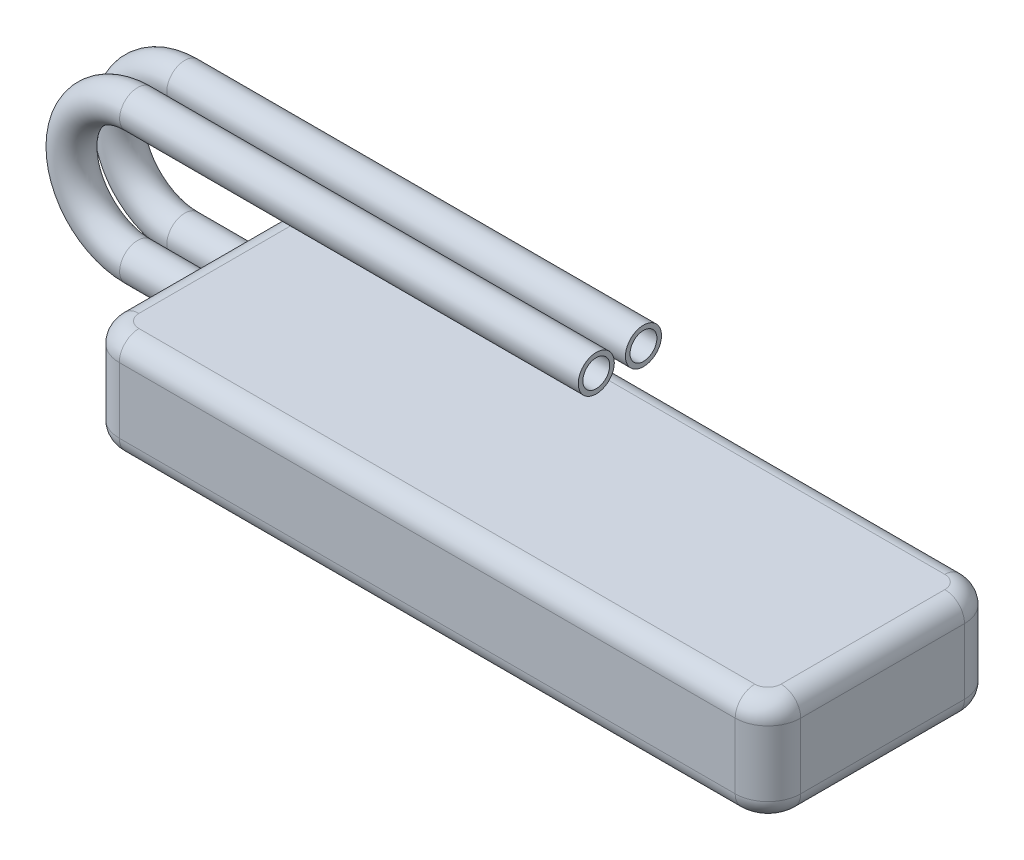
ISO-10303-21;
HEADER;
FILE_DESCRIPTION(('STEP AP214'),'2;1');
FILE_NAME('part.step','',(''),(''),'','','');
FILE_SCHEMA(('AUTOMOTIVE_DESIGN { 1 0 10303 214 1 1 1 1 }'));
ENDSEC;
DATA;
#1=APPLICATION_CONTEXT('core data for automotive mechanical design processes');
#2=APPLICATION_PROTOCOL_DEFINITION('international standard','automotive_design',2000,#1);
#3=PRODUCT_CONTEXT('',#1,'mechanical');
#4=PRODUCT('Part','Part','',(#3));
#5=PRODUCT_RELATED_PRODUCT_CATEGORY('part','',(#4));
#6=PRODUCT_DEFINITION_FORMATION('','',#4);
#7=PRODUCT_DEFINITION_CONTEXT('part definition',#1,'design');
#8=PRODUCT_DEFINITION('design','',#6,#7);
#9=PRODUCT_DEFINITION_SHAPE('','',#8);
#10=(LENGTH_UNIT() NAMED_UNIT(*) SI_UNIT(.MILLI.,.METRE.));
#11=(NAMED_UNIT(*) PLANE_ANGLE_UNIT() SI_UNIT($,.RADIAN.));
#12=(NAMED_UNIT(*) SI_UNIT($,.STERADIAN.) SOLID_ANGLE_UNIT());
#13=UNCERTAINTY_MEASURE_WITH_UNIT(LENGTH_MEASURE(1.E-05),#10,'distance_accuracy_value','');
#14=(GEOMETRIC_REPRESENTATION_CONTEXT(3) GLOBAL_UNCERTAINTY_ASSIGNED_CONTEXT((#13)) GLOBAL_UNIT_ASSIGNED_CONTEXT((#10,
#11,#12)) REPRESENTATION_CONTEXT('',''));
#15=CARTESIAN_POINT('',(0.,0.,0.));
#16=DIRECTION('',(0.,0.,1.));
#17=DIRECTION('',(1.,0.,0.));
#18=AXIS2_PLACEMENT_3D('',#15,#16,#17);
#19=CARTESIAN_POINT('',(0.,16.,-35.));
#20=DIRECTION('',(0.,1.,0.));
#21=DIRECTION('',(0.,0.,1.));
#22=AXIS2_PLACEMENT_3D('',#19,#20,#21);
#23=PLANE('',#22);
#24=CARTESIAN_POINT('',(5.,16.,-5.));
#25=DIRECTION('',(0.,1.,0.));
#26=DIRECTION('',(0.,0.,1.));
#27=AXIS2_PLACEMENT_3D('',#24,#25,#26);
#28=CIRCLE('',#27,2.);
#29=CARTESIAN_POINT('',(5.,16.,-3.));
#30=VERTEX_POINT('',#29);
#31=CARTESIAN_POINT('',(3.,16.,-5.));
#32=VERTEX_POINT('',#31);
#33=EDGE_CURVE('E274',#30,#32,#28,.F.);
#34=ORIENTED_EDGE('',*,*,#33,.F.);
#35=DIRECTION('',(-1.,0.,0.));
#36=VECTOR('',#35,1.);
#37=CARTESIAN_POINT('',(104.,16.,-3.));
#38=LINE('',#37,#36);
#39=CARTESIAN_POINT('',(99.,16.,-3.));
#40=VERTEX_POINT('',#39);
#41=EDGE_CURVE('E254',#30,#40,#38,.F.);
#42=ORIENTED_EDGE('',*,*,#41,.T.);
#43=CARTESIAN_POINT('',(99.,16.,-5.));
#44=DIRECTION('',(0.,1.,0.));
#45=DIRECTION('',(0.,0.,1.));
#46=AXIS2_PLACEMENT_3D('',#43,#44,#45);
#47=CIRCLE('',#46,2.);
#48=CARTESIAN_POINT('',(101.,16.,-5.));
#49=VERTEX_POINT('',#48);
#50=EDGE_CURVE('E271',#49,#40,#47,.F.);
#51=ORIENTED_EDGE('',*,*,#50,.F.);
#52=DIRECTION('',(0.,0.,1.));
#53=VECTOR('',#52,1.);
#54=CARTESIAN_POINT('',(101.,16.,-35.));
#55=LINE('',#54,#53);
#56=CARTESIAN_POINT('',(101.,16.,-30.));
#57=VERTEX_POINT('',#56);
#58=EDGE_CURVE('E251',#49,#57,#55,.F.);
#59=ORIENTED_EDGE('',*,*,#58,.T.);
#60=CARTESIAN_POINT('',(99.,16.,-30.));
#61=DIRECTION('',(0.,1.,0.));
#62=DIRECTION('',(0.,0.,1.));
#63=AXIS2_PLACEMENT_3D('',#60,#61,#62);
#64=CIRCLE('',#63,2.);
#65=CARTESIAN_POINT('',(99.,16.,-32.));
#66=VERTEX_POINT('',#65);
#67=EDGE_CURVE('E250',#66,#57,#64,.F.);
#68=ORIENTED_EDGE('',*,*,#67,.F.);
#69=DIRECTION('',(-1.,0.,0.));
#70=VECTOR('',#69,1.);
#71=CARTESIAN_POINT('',(0.,16.,-32.));
#72=LINE('',#71,#70);
#73=CARTESIAN_POINT('',(5.,16.,-32.));
#74=VERTEX_POINT('',#73);
#75=EDGE_CURVE('E244',#66,#74,#72,.T.);
#76=ORIENTED_EDGE('',*,*,#75,.T.);
#77=CARTESIAN_POINT('',(5.,16.,-30.));
#78=DIRECTION('',(0.,1.,0.));
#79=DIRECTION('',(0.,0.,1.));
#80=AXIS2_PLACEMENT_3D('',#77,#78,#79);
#81=CIRCLE('',#80,2.);
#82=CARTESIAN_POINT('',(3.,16.,-30.));
#83=VERTEX_POINT('',#82);
#84=EDGE_CURVE('E241',#83,#74,#81,.F.);
#85=ORIENTED_EDGE('',*,*,#84,.F.);
#86=DIRECTION('',(0.,0.,1.));
#87=VECTOR('',#86,1.);
#88=CARTESIAN_POINT('',(3.,16.,-35.));
#89=LINE('',#88,#87);
#90=EDGE_CURVE('E172',#83,#32,#89,.T.);
#91=ORIENTED_EDGE('',*,*,#90,.T.);
#92=EDGE_LOOP('',(#34,#42,#51,#59,#68,#76,#85,#91));
#93=FACE_BOUND('',#92,.T.);
#94=ADVANCED_FACE('F43',(#93),#23,.T.);
#95=CARTESIAN_POINT('',(0.,0.,-35.));
#96=DIRECTION('',(0.,-1.,0.));
#97=DIRECTION('',(0.,0.,-1.));
#98=AXIS2_PLACEMENT_3D('',#95,#96,#97);
#99=PLANE('',#98);
#100=CARTESIAN_POINT('',(5.,0.,-5.));
#101=DIRECTION('',(0.,-1.,0.));
#102=DIRECTION('',(0.,0.,-1.));
#103=AXIS2_PLACEMENT_3D('',#100,#101,#102);
#104=CIRCLE('',#103,2.);
#105=CARTESIAN_POINT('',(3.,0.,-5.));
#106=VERTEX_POINT('',#105);
#107=CARTESIAN_POINT('',(5.,0.,-3.));
#108=VERTEX_POINT('',#107);
#109=EDGE_CURVE('E262',#106,#108,#104,.F.);
#110=ORIENTED_EDGE('',*,*,#109,.F.);
#111=DIRECTION('',(0.,0.,1.));
#112=VECTOR('',#111,1.);
#113=CARTESIAN_POINT('',(3.,0.,-35.));
#114=LINE('',#113,#112);
#115=CARTESIAN_POINT('',(3.,0.,-30.));
#116=VERTEX_POINT('',#115);
#117=EDGE_CURVE('E166',#106,#116,#114,.F.);
#118=ORIENTED_EDGE('',*,*,#117,.T.);
#119=CARTESIAN_POINT('',(5.,0.,-30.));
#120=DIRECTION('',(0.,-1.,0.));
#121=DIRECTION('',(0.,0.,-1.));
#122=AXIS2_PLACEMENT_3D('',#119,#120,#121);
#123=CIRCLE('',#122,2.);
#124=CARTESIAN_POINT('',(5.,0.,-32.));
#125=VERTEX_POINT('',#124);
#126=EDGE_CURVE('E159',#125,#116,#123,.F.);
#127=ORIENTED_EDGE('',*,*,#126,.F.);
#128=DIRECTION('',(1.,0.,0.));
#129=VECTOR('',#128,1.);
#130=CARTESIAN_POINT('',(0.,0.,-32.));
#131=LINE('',#130,#129);
#132=CARTESIAN_POINT('',(99.,0.,-32.));
#133=VERTEX_POINT('',#132);
#134=EDGE_CURVE('E163',#125,#133,#131,.T.);
#135=ORIENTED_EDGE('',*,*,#134,.T.);
#136=CARTESIAN_POINT('',(99.,0.,-30.));
#137=DIRECTION('',(0.,-1.,0.));
#138=DIRECTION('',(0.,0.,-1.));
#139=AXIS2_PLACEMENT_3D('',#136,#137,#138);
#140=CIRCLE('',#139,2.);
#141=CARTESIAN_POINT('',(101.,0.,-30.));
#142=VERTEX_POINT('',#141);
#143=EDGE_CURVE('E171',#142,#133,#140,.F.);
#144=ORIENTED_EDGE('',*,*,#143,.F.);
#145=DIRECTION('',(0.,0.,1.));
#146=VECTOR('',#145,1.);
#147=CARTESIAN_POINT('',(101.,0.,-35.));
#148=LINE('',#147,#146);
#149=CARTESIAN_POINT('',(101.,0.,-5.));
#150=VERTEX_POINT('',#149);
#151=EDGE_CURVE('E180',#142,#150,#148,.T.);
#152=ORIENTED_EDGE('',*,*,#151,.T.);
#153=CARTESIAN_POINT('',(99.,0.,-5.));
#154=DIRECTION('',(0.,-1.,0.));
#155=DIRECTION('',(0.,0.,-1.));
#156=AXIS2_PLACEMENT_3D('',#153,#154,#155);
#157=CIRCLE('',#156,2.);
#158=CARTESIAN_POINT('',(99.,0.,-3.));
#159=VERTEX_POINT('',#158);
#160=EDGE_CURVE('E259',#159,#150,#157,.F.);
#161=ORIENTED_EDGE('',*,*,#160,.F.);
#162=DIRECTION('',(1.,0.,0.));
#163=VECTOR('',#162,1.);
#164=CARTESIAN_POINT('',(0.,0.,-3.));
#165=LINE('',#164,#163);
#166=EDGE_CURVE('E337',#159,#108,#165,.F.);
#167=ORIENTED_EDGE('',*,*,#166,.T.);
#168=EDGE_LOOP('',(#110,#118,#127,#135,#144,#152,#161,#167));
#169=FACE_BOUND('',#168,.T.);
#170=ADVANCED_FACE('F162',(#169),#99,.T.);
#171=CARTESIAN_POINT('',(0.,0.,-35.));
#172=DIRECTION('',(-1.,0.,0.));
#173=DIRECTION('',(0.,0.,1.));
#174=AXIS2_PLACEMENT_3D('',#171,#172,#173);
#175=PLANE('',#174);
#176=DIRECTION('',(0.,0.,1.));
#177=VECTOR('',#176,1.);
#178=CARTESIAN_POINT('',(0.,13.,-35.));
#179=LINE('',#178,#177);
#180=CARTESIAN_POINT('',(0.,13.,-5.));
#181=VERTEX_POINT('',#180);
#182=CARTESIAN_POINT('',(0.,13.,-30.));
#183=VERTEX_POINT('',#182);
#184=EDGE_CURVE('E327',#181,#183,#179,.F.);
#185=ORIENTED_EDGE('',*,*,#184,.T.);
#186=DIRECTION('',(0.,-1.,0.));
#187=VECTOR('',#186,1.);
#188=CARTESIAN_POINT('',(0.,0.,-30.));
#189=LINE('',#188,#187);
#190=CARTESIAN_POINT('',(0.,3.,-30.));
#191=VERTEX_POINT('',#190);
#192=EDGE_CURVE('E203',#183,#191,#189,.T.);
#193=ORIENTED_EDGE('',*,*,#192,.T.);
#194=DIRECTION('',(0.,0.,1.));
#195=VECTOR('',#194,1.);
#196=CARTESIAN_POINT('',(0.,3.,-35.));
#197=LINE('',#196,#195);
#198=CARTESIAN_POINT('',(0.,3.,-5.));
#199=VERTEX_POINT('',#198);
#200=EDGE_CURVE('E324',#191,#199,#197,.T.);
#201=ORIENTED_EDGE('',*,*,#200,.T.);
#202=DIRECTION('',(0.,-1.,0.));
#203=VECTOR('',#202,1.);
#204=CARTESIAN_POINT('',(0.,13.,-5.));
#205=LINE('',#204,#203);
#206=EDGE_CURVE('E201',#199,#181,#205,.F.);
#207=ORIENTED_EDGE('',*,*,#206,.T.);
#208=EDGE_LOOP('',(#185,#193,#201,#207));
#209=FACE_BOUND('',#208,.T.);
#210=CARTESIAN_POINT('',(0.,10.,-25.));
#211=DIRECTION('',(1.,0.,0.));
#212=DIRECTION('',(0.,0.,-1.));
#213=AXIS2_PLACEMENT_3D('',#210,#211,#212);
#214=CIRCLE('',#213,2.75000000000001);
#215=CARTESIAN_POINT('',(0.,10.,-27.75));
#216=VERTEX_POINT('',#215);
#217=EDGE_CURVE('E344',#216,#216,#214,.T.);
#218=ORIENTED_EDGE('',*,*,#217,.T.);
#219=EDGE_LOOP('',(#218));
#220=FACE_BOUND('',#219,.T.);
#221=CARTESIAN_POINT('',(0.,10.,-17.8));
#222=DIRECTION('',(1.,0.,0.));
#223=DIRECTION('',(0.,0.,-1.));
#224=AXIS2_PLACEMENT_3D('',#221,#222,#223);
#225=CIRCLE('',#224,2.75000000000001);
#226=CARTESIAN_POINT('',(0.,10.,-20.55));
#227=VERTEX_POINT('',#226);
#228=EDGE_CURVE('E368',#227,#227,#225,.T.);
#229=ORIENTED_EDGE('',*,*,#228,.T.);
#230=EDGE_LOOP('',(#229));
#231=FACE_BOUND('',#230,.T.);
#232=ADVANCED_FACE('F412',(#209,#220,#231),#175,.T.);
#233=CARTESIAN_POINT('',(104.,0.,-35.));
#234=DIRECTION('',(1.,0.,0.));
#235=DIRECTION('',(0.,0.,-1.));
#236=AXIS2_PLACEMENT_3D('',#233,#234,#235);
#237=PLANE('',#236);
#238=DIRECTION('',(0.,0.,1.));
#239=VECTOR('',#238,1.);
#240=CARTESIAN_POINT('',(104.,3.,-35.));
#241=LINE('',#240,#239);
#242=CARTESIAN_POINT('',(104.,3.,-5.));
#243=VERTEX_POINT('',#242);
#244=CARTESIAN_POINT('',(104.,3.,-30.));
#245=VERTEX_POINT('',#244);
#246=EDGE_CURVE('E302',#243,#245,#241,.F.);
#247=ORIENTED_EDGE('',*,*,#246,.T.);
#248=DIRECTION('',(0.,1.,0.));
#249=VECTOR('',#248,1.);
#250=CARTESIAN_POINT('',(104.,0.,-30.));
#251=LINE('',#250,#249);
#252=CARTESIAN_POINT('',(104.,13.,-30.));
#253=VERTEX_POINT('',#252);
#254=EDGE_CURVE('E210',#245,#253,#251,.T.);
#255=ORIENTED_EDGE('',*,*,#254,.T.);
#256=DIRECTION('',(0.,0.,1.));
#257=VECTOR('',#256,1.);
#258=CARTESIAN_POINT('',(104.,13.,-35.));
#259=LINE('',#258,#257);
#260=CARTESIAN_POINT('',(104.,13.,-5.));
#261=VERTEX_POINT('',#260);
#262=EDGE_CURVE('E292',#253,#261,#259,.T.);
#263=ORIENTED_EDGE('',*,*,#262,.T.);
#264=DIRECTION('',(0.,1.,0.));
#265=VECTOR('',#264,1.);
#266=CARTESIAN_POINT('',(104.,3.,-5.));
#267=LINE('',#266,#265);
#268=EDGE_CURVE('E208',#261,#243,#267,.F.);
#269=ORIENTED_EDGE('',*,*,#268,.T.);
#270=EDGE_LOOP('',(#247,#255,#263,#269));
#271=FACE_BOUND('',#270,.T.);
#272=ADVANCED_FACE('F299',(#271),#237,.T.);
#273=CARTESIAN_POINT('',(0.,0.,-35.));
#274=DIRECTION('',(0.,0.,-1.));
#275=DIRECTION('',(-1.,0.,0.));
#276=AXIS2_PLACEMENT_3D('',#273,#274,#275);
#277=PLANE('',#276);
#278=DIRECTION('',(1.,0.,0.));
#279=VECTOR('',#278,1.);
#280=CARTESIAN_POINT('',(0.,3.,-35.));
#281=LINE('',#280,#279);
#282=CARTESIAN_POINT('',(99.,3.,-35.));
#283=VERTEX_POINT('',#282);
#284=CARTESIAN_POINT('',(5.,3.,-35.));
#285=VERTEX_POINT('',#284);
#286=EDGE_CURVE('E330',#283,#285,#281,.F.);
#287=ORIENTED_EDGE('',*,*,#286,.T.);
#288=DIRECTION('',(0.,-1.,0.));
#289=VECTOR('',#288,1.);
#290=CARTESIAN_POINT('',(5.,0.,-35.));
#291=LINE('',#290,#289);
#292=CARTESIAN_POINT('',(5.,13.,-35.));
#293=VERTEX_POINT('',#292);
#294=EDGE_CURVE('E67',#285,#293,#291,.F.);
#295=ORIENTED_EDGE('',*,*,#294,.T.);
#296=DIRECTION('',(-1.,0.,0.));
#297=VECTOR('',#296,1.);
#298=CARTESIAN_POINT('',(0.,13.,-35.));
#299=LINE('',#298,#297);
#300=CARTESIAN_POINT('',(99.,13.,-35.));
#301=VERTEX_POINT('',#300);
#302=EDGE_CURVE('E245',#293,#301,#299,.F.);
#303=ORIENTED_EDGE('',*,*,#302,.T.);
#304=DIRECTION('',(0.,1.,0.));
#305=VECTOR('',#304,1.);
#306=CARTESIAN_POINT('',(99.,0.,-35.));
#307=LINE('',#306,#305);
#308=EDGE_CURVE('E205',#301,#283,#307,.F.);
#309=ORIENTED_EDGE('',*,*,#308,.T.);
#310=EDGE_LOOP('',(#287,#295,#303,#309));
#311=FACE_BOUND('',#310,.T.);
#312=ADVANCED_FACE('F419',(#311),#277,.T.);
#313=CARTESIAN_POINT('',(0.,0.,0.));
#314=DIRECTION('',(0.,0.,-1.));
#315=DIRECTION('',(-1.,0.,0.));
#316=AXIS2_PLACEMENT_3D('',#313,#314,#315);
#317=PLANE('',#316);
#318=DIRECTION('',(1.,0.,0.));
#319=VECTOR('',#318,1.);
#320=CARTESIAN_POINT('',(104.,3.,0.));
#321=LINE('',#320,#319);
#322=CARTESIAN_POINT('',(5.,3.,0.));
#323=VERTEX_POINT('',#322);
#324=CARTESIAN_POINT('',(99.,3.,0.));
#325=VERTEX_POINT('',#324);
#326=EDGE_CURVE('E319',#323,#325,#321,.T.);
#327=ORIENTED_EDGE('',*,*,#326,.T.);
#328=DIRECTION('',(0.,1.,0.));
#329=VECTOR('',#328,1.);
#330=CARTESIAN_POINT('',(99.,13.,0.));
#331=LINE('',#330,#329);
#332=CARTESIAN_POINT('',(99.,13.,0.));
#333=VERTEX_POINT('',#332);
#334=EDGE_CURVE('E11',#325,#333,#331,.T.);
#335=ORIENTED_EDGE('',*,*,#334,.T.);
#336=DIRECTION('',(-1.,0.,0.));
#337=VECTOR('',#336,1.);
#338=CARTESIAN_POINT('',(0.,13.,0.));
#339=LINE('',#338,#337);
#340=CARTESIAN_POINT('',(5.,13.,0.));
#341=VERTEX_POINT('',#340);
#342=EDGE_CURVE('E318',#333,#341,#339,.T.);
#343=ORIENTED_EDGE('',*,*,#342,.T.);
#344=DIRECTION('',(0.,-1.,0.));
#345=VECTOR('',#344,1.);
#346=CARTESIAN_POINT('',(5.,3.,0.));
#347=LINE('',#346,#345);
#348=EDGE_CURVE('E52',#341,#323,#347,.T.);
#349=ORIENTED_EDGE('',*,*,#348,.T.);
#350=EDGE_LOOP('',(#327,#335,#343,#349));
#351=FACE_BOUND('',#350,.T.);
#352=ADVANCED_FACE('F416',(#351),#317,.F.);
#353=CARTESIAN_POINT('',(0.,10.,-25.));
#354=DIRECTION('',(-1.,0.,0.));
#355=DIRECTION('',(0.,-1.,0.));
#356=AXIS2_PLACEMENT_3D('',#353,#354,#355);
#357=CYLINDRICAL_SURFACE('',#356,2.75000000000001);
#358=CARTESIAN_POINT('',(-10.,10.,-25.));
#359=DIRECTION('',(1.,0.,0.));
#360=DIRECTION('',(0.,0.,-1.));
#361=AXIS2_PLACEMENT_3D('',#358,#359,#360);
#362=CIRCLE('',#361,2.75000000000001);
#363=CARTESIAN_POINT('',(-10.,7.24999999999999,-25.));
#364=VERTEX_POINT('',#363);
#365=EDGE_CURVE('E345',#364,#364,#362,.T.);
#366=ORIENTED_EDGE('',*,*,#365,.T.);
#367=EDGE_LOOP('',(#366));
#368=FACE_BOUND('',#367,.T.);
#369=ORIENTED_EDGE('',*,*,#217,.F.);
#370=EDGE_LOOP('',(#369));
#371=FACE_BOUND('',#370,.T.);
#372=ADVANCED_FACE('F582',(#368,#371),#357,.T.);
#373=CARTESIAN_POINT('',(-10.,20.1,-25.));
#374=DIRECTION('',(0.,0.,-1.));
#375=DIRECTION('',(-1.,0.,0.));
#376=AXIS2_PLACEMENT_3D('',#373,#374,#375);
#377=TOROIDAL_SURFACE('',#376,10.1,2.75000000000001);
#378=CARTESIAN_POINT('',(-10.,30.2,-25.));
#379=DIRECTION('',(-1.,0.,0.));
#380=DIRECTION('',(0.,0.,-1.));
#381=AXIS2_PLACEMENT_3D('',#378,#379,#380);
#382=CIRCLE('',#381,2.75000000000001);
#383=CARTESIAN_POINT('',(-10.,32.95,-25.));
#384=VERTEX_POINT('',#383);
#385=EDGE_CURVE('E341',#384,#384,#382,.T.);
#386=CARTESIAN_POINT('',(-10.,20.1,-25.));
#387=DIRECTION('',(0.,0.,-1.));
#388=DIRECTION('',(-1.,0.,0.));
#389=AXIS2_PLACEMENT_3D('',#386,#387,#388);
#390=CIRCLE('',#389,12.85);
#391=EDGE_CURVE('',#364,#384,#390,.T.);
#392=ORIENTED_EDGE('',*,*,#365,.F.);
#393=ORIENTED_EDGE('',*,*,#385,.T.);
#394=ORIENTED_EDGE('',*,*,#391,.T.);
#395=ORIENTED_EDGE('',*,*,#391,.F.);
#396=EDGE_LOOP('',(#392,#394,#393,#395));
#397=FACE_BOUND('',#396,.T.);
#398=ADVANCED_FACE('F749',(#397),#377,.T.);
#399=CARTESIAN_POINT('',(-10.,30.2,-25.));
#400=DIRECTION('',(1.,0.,0.));
#401=DIRECTION('',(0.,0.,-1.));
#402=AXIS2_PLACEMENT_3D('',#399,#400,#401);
#403=CYLINDRICAL_SURFACE('',#402,2.75000000000001);
#404=CARTESIAN_POINT('',(60.,30.2,-25.));
#405=DIRECTION('',(-1.,0.,0.));
#406=DIRECTION('',(0.,0.,-1.));
#407=AXIS2_PLACEMENT_3D('',#404,#405,#406);
#408=CIRCLE('',#407,2.75000000000001);
#409=CARTESIAN_POINT('',(60.,30.2,-27.75));
#410=VERTEX_POINT('',#409);
#411=EDGE_CURVE('E351',#410,#410,#408,.T.);
#412=ORIENTED_EDGE('',*,*,#411,.T.);
#413=EDGE_LOOP('',(#412));
#414=FACE_BOUND('',#413,.T.);
#415=ORIENTED_EDGE('',*,*,#385,.F.);
#416=EDGE_LOOP('',(#415));
#417=FACE_BOUND('',#416,.T.);
#418=ADVANCED_FACE('F740',(#414,#417),#403,.T.);
#419=CARTESIAN_POINT('',(60.,30.2,-25.));
#420=DIRECTION('',(-1.,0.,0.));
#421=DIRECTION('',(0.,0.,-1.));
#422=AXIS2_PLACEMENT_3D('',#419,#420,#421);
#423=PLANE('',#422);
#424=CARTESIAN_POINT('',(60.,30.2,-25.));
#425=DIRECTION('',(-1.,0.,0.));
#426=DIRECTION('',(0.,0.,-1.));
#427=AXIS2_PLACEMENT_3D('',#424,#425,#426);
#428=CIRCLE('',#427,2.05);
#429=CARTESIAN_POINT('',(60.,30.2,-27.05));
#430=VERTEX_POINT('',#429);
#431=EDGE_CURVE('E340',#430,#430,#428,.F.);
#432=ORIENTED_EDGE('',*,*,#431,.F.);
#433=EDGE_LOOP('',(#432));
#434=FACE_BOUND('',#433,.T.);
#435=ORIENTED_EDGE('',*,*,#411,.F.);
#436=EDGE_LOOP('',(#435));
#437=FACE_BOUND('',#436,.T.);
#438=ADVANCED_FACE('F731',(#434,#437),#423,.F.);
#439=CARTESIAN_POINT('',(0.,10.,-25.));
#440=DIRECTION('',(-1.,0.,0.));
#441=DIRECTION('',(0.,-1.,0.));
#442=AXIS2_PLACEMENT_3D('',#439,#440,#441);
#443=CYLINDRICAL_SURFACE('',#442,2.05);
#444=CARTESIAN_POINT('',(-10.,10.,-25.));
#445=DIRECTION('',(1.,0.,0.));
#446=DIRECTION('',(0.,0.,-1.));
#447=AXIS2_PLACEMENT_3D('',#444,#445,#446);
#448=CIRCLE('',#447,2.05);
#449=CARTESIAN_POINT('',(-10.,7.95,-25.));
#450=VERTEX_POINT('',#449);
#451=EDGE_CURVE('E360',#450,#450,#448,.F.);
#452=ORIENTED_EDGE('',*,*,#451,.T.);
#453=EDGE_LOOP('',(#452));
#454=FACE_BOUND('',#453,.T.);
#455=CARTESIAN_POINT('',(0.,10.,-25.));
#456=DIRECTION('',(1.,0.,0.));
#457=DIRECTION('',(0.,0.,-1.));
#458=AXIS2_PLACEMENT_3D('',#455,#456,#457);
#459=CIRCLE('',#458,2.05);
#460=CARTESIAN_POINT('',(0.,10.,-27.05));
#461=VERTEX_POINT('',#460);
#462=EDGE_CURVE('E354',#461,#461,#459,.F.);
#463=ORIENTED_EDGE('',*,*,#462,.F.);
#464=EDGE_LOOP('',(#463));
#465=FACE_BOUND('',#464,.T.);
#466=ADVANCED_FACE('F722',(#454,#465),#443,.F.);
#467=CARTESIAN_POINT('',(-10.,20.1,-25.));
#468=DIRECTION('',(0.,0.,-1.));
#469=DIRECTION('',(-1.,0.,0.));
#470=AXIS2_PLACEMENT_3D('',#467,#468,#469);
#471=TOROIDAL_SURFACE('',#470,10.1,2.05);
#472=CARTESIAN_POINT('',(-10.,30.2,-25.));
#473=DIRECTION('',(-1.,0.,0.));
#474=DIRECTION('',(0.,0.,-1.));
#475=AXIS2_PLACEMENT_3D('',#472,#473,#474);
#476=CIRCLE('',#475,2.05);
#477=CARTESIAN_POINT('',(-10.,32.25,-25.));
#478=VERTEX_POINT('',#477);
#479=EDGE_CURVE('E357',#478,#478,#476,.F.);
#480=CARTESIAN_POINT('',(-10.,20.1,-25.));
#481=DIRECTION('',(0.,0.,-1.));
#482=DIRECTION('',(-1.,0.,0.));
#483=AXIS2_PLACEMENT_3D('',#480,#481,#482);
#484=CIRCLE('',#483,12.15);
#485=EDGE_CURVE('',#450,#478,#484,.T.);
#486=ORIENTED_EDGE('',*,*,#451,.F.);
#487=ORIENTED_EDGE('',*,*,#479,.T.);
#488=ORIENTED_EDGE('',*,*,#485,.T.);
#489=ORIENTED_EDGE('',*,*,#485,.F.);
#490=EDGE_LOOP('',(#486,#488,#487,#489));
#491=FACE_BOUND('',#490,.T.);
#492=ADVANCED_FACE('F713',(#491),#471,.F.);
#493=CARTESIAN_POINT('',(-10.,30.2,-25.));
#494=DIRECTION('',(1.,0.,0.));
#495=DIRECTION('',(0.,0.,-1.));
#496=AXIS2_PLACEMENT_3D('',#493,#494,#495);
#497=CYLINDRICAL_SURFACE('',#496,2.05);
#498=ORIENTED_EDGE('',*,*,#431,.T.);
#499=EDGE_LOOP('',(#498));
#500=FACE_BOUND('',#499,.T.);
#501=ORIENTED_EDGE('',*,*,#479,.F.);
#502=EDGE_LOOP('',(#501));
#503=FACE_BOUND('',#502,.T.);
#504=ADVANCED_FACE('F584',(#500,#503),#497,.F.);
#505=ORIENTED_EDGE('',*,*,#462,.T.);
#506=EDGE_LOOP('',(#505));
#507=FACE_BOUND('',#506,.T.);
#508=ADVANCED_FACE('F424',(#507),#175,.T.);
#509=CARTESIAN_POINT('',(0.,10.,-17.8));
#510=DIRECTION('',(-1.,0.,0.));
#511=DIRECTION('',(0.,-1.,0.));
#512=AXIS2_PLACEMENT_3D('',#509,#510,#511);
#513=CYLINDRICAL_SURFACE('',#512,2.75000000000001);
#514=CARTESIAN_POINT('',(-10.,10.,-17.8));
#515=DIRECTION('',(1.,0.,0.));
#516=DIRECTION('',(0.,0.,-1.));
#517=AXIS2_PLACEMENT_3D('',#514,#515,#516);
#518=CIRCLE('',#517,2.75000000000001);
#519=CARTESIAN_POINT('',(-10.,7.24999999999999,-17.8));
#520=VERTEX_POINT('',#519);
#521=EDGE_CURVE('E220',#520,#520,#518,.T.);
#522=ORIENTED_EDGE('',*,*,#521,.T.);
#523=EDGE_LOOP('',(#522));
#524=FACE_BOUND('',#523,.T.);
#525=ORIENTED_EDGE('',*,*,#228,.F.);
#526=EDGE_LOOP('',(#525));
#527=FACE_BOUND('',#526,.T.);
#528=ADVANCED_FACE('F694',(#524,#527),#513,.T.);
#529=CARTESIAN_POINT('',(-10.,20.1,-17.8));
#530=DIRECTION('',(0.,0.,-1.));
#531=DIRECTION('',(-1.,0.,0.));
#532=AXIS2_PLACEMENT_3D('',#529,#530,#531);
#533=TOROIDAL_SURFACE('',#532,10.1,2.75000000000001);
#534=CARTESIAN_POINT('',(-10.,30.2,-17.8));
#535=DIRECTION('',(-1.,0.,0.));
#536=DIRECTION('',(0.,0.,-1.));
#537=AXIS2_PLACEMENT_3D('',#534,#535,#536);
#538=CIRCLE('',#537,2.75000000000001);
#539=CARTESIAN_POINT('',(-10.,32.95,-17.8));
#540=VERTEX_POINT('',#539);
#541=EDGE_CURVE('E365',#540,#540,#538,.T.);
#542=CARTESIAN_POINT('',(-10.,20.1,-17.8));
#543=DIRECTION('',(0.,0.,-1.));
#544=DIRECTION('',(-1.,0.,0.));
#545=AXIS2_PLACEMENT_3D('',#542,#543,#544);
#546=CIRCLE('',#545,12.85);
#547=EDGE_CURVE('',#520,#540,#546,.T.);
#548=ORIENTED_EDGE('',*,*,#521,.F.);
#549=ORIENTED_EDGE('',*,*,#541,.T.);
#550=ORIENTED_EDGE('',*,*,#547,.T.);
#551=ORIENTED_EDGE('',*,*,#547,.F.);
#552=EDGE_LOOP('',(#548,#550,#549,#551));
#553=FACE_BOUND('',#552,.T.);
#554=ADVANCED_FACE('F684',(#553),#533,.T.);
#555=CARTESIAN_POINT('',(-10.,30.2,-17.8));
#556=DIRECTION('',(1.,0.,0.));
#557=DIRECTION('',(0.,0.,-1.));
#558=AXIS2_PLACEMENT_3D('',#555,#556,#557);
#559=CYLINDRICAL_SURFACE('',#558,2.75000000000001);
#560=CARTESIAN_POINT('',(60.,30.2,-17.8));
#561=DIRECTION('',(-1.,0.,0.));
#562=DIRECTION('',(0.,0.,-1.));
#563=AXIS2_PLACEMENT_3D('',#560,#561,#562);
#564=CIRCLE('',#563,2.75000000000001);
#565=CARTESIAN_POINT('',(60.,30.2,-20.55));
#566=VERTEX_POINT('',#565);
#567=EDGE_CURVE('E373',#566,#566,#564,.T.);
#568=ORIENTED_EDGE('',*,*,#567,.T.);
#569=EDGE_LOOP('',(#568));
#570=FACE_BOUND('',#569,.T.);
#571=ORIENTED_EDGE('',*,*,#541,.F.);
#572=EDGE_LOOP('',(#571));
#573=FACE_BOUND('',#572,.T.);
#574=ADVANCED_FACE('F403',(#570,#573),#559,.T.);
#575=CARTESIAN_POINT('',(60.,30.2,-17.8));
#576=DIRECTION('',(-1.,0.,0.));
#577=DIRECTION('',(0.,0.,-1.));
#578=AXIS2_PLACEMENT_3D('',#575,#576,#577);
#579=PLANE('',#578);
#580=CARTESIAN_POINT('',(60.,30.2,-17.8));
#581=DIRECTION('',(-1.,0.,0.));
#582=DIRECTION('',(0.,0.,-1.));
#583=AXIS2_PLACEMENT_3D('',#580,#581,#582);
#584=CIRCLE('',#583,2.05);
#585=CARTESIAN_POINT('',(60.,30.2,-19.85));
#586=VERTEX_POINT('',#585);
#587=EDGE_CURVE('E348',#586,#586,#584,.F.);
#588=ORIENTED_EDGE('',*,*,#587,.F.);
#589=EDGE_LOOP('',(#588));
#590=FACE_BOUND('',#589,.T.);
#591=ORIENTED_EDGE('',*,*,#567,.F.);
#592=EDGE_LOOP('',(#591));
#593=FACE_BOUND('',#592,.T.);
#594=ADVANCED_FACE('F393',(#590,#593),#579,.F.);
#595=CARTESIAN_POINT('',(0.,10.,-17.8));
#596=DIRECTION('',(-1.,0.,0.));
#597=DIRECTION('',(0.,-1.,0.));
#598=AXIS2_PLACEMENT_3D('',#595,#596,#597);
#599=CYLINDRICAL_SURFACE('',#598,2.05);
#600=CARTESIAN_POINT('',(-10.,10.,-17.8));
#601=DIRECTION('',(1.,0.,0.));
#602=DIRECTION('',(0.,0.,-1.));
#603=AXIS2_PLACEMENT_3D('',#600,#601,#602);
#604=CIRCLE('',#603,2.05);
#605=CARTESIAN_POINT('',(-10.,7.94999999999999,-17.8));
#606=VERTEX_POINT('',#605);
#607=EDGE_CURVE('E382',#606,#606,#604,.F.);
#608=ORIENTED_EDGE('',*,*,#607,.T.);
#609=EDGE_LOOP('',(#608));
#610=FACE_BOUND('',#609,.T.);
#611=CARTESIAN_POINT('',(0.,10.,-17.8));
#612=DIRECTION('',(1.,0.,0.));
#613=DIRECTION('',(0.,0.,-1.));
#614=AXIS2_PLACEMENT_3D('',#611,#612,#613);
#615=CIRCLE('',#614,2.05);
#616=CARTESIAN_POINT('',(0.,10.,-19.85));
#617=VERTEX_POINT('',#616);
#618=EDGE_CURVE('E376',#617,#617,#615,.F.);
#619=ORIENTED_EDGE('',*,*,#618,.F.);
#620=EDGE_LOOP('',(#619));
#621=FACE_BOUND('',#620,.T.);
#622=ADVANCED_FACE('F390',(#610,#621),#599,.F.);
#623=CARTESIAN_POINT('',(-10.,20.1,-17.8));
#624=DIRECTION('',(0.,0.,-1.));
#625=DIRECTION('',(-1.,0.,0.));
#626=AXIS2_PLACEMENT_3D('',#623,#624,#625);
#627=TOROIDAL_SURFACE('',#626,10.1,2.05);
#628=CARTESIAN_POINT('',(-10.,30.2,-17.8));
#629=DIRECTION('',(-1.,0.,0.));
#630=DIRECTION('',(0.,0.,-1.));
#631=AXIS2_PLACEMENT_3D('',#628,#629,#630);
#632=CIRCLE('',#631,2.05);
#633=CARTESIAN_POINT('',(-10.,32.25,-17.8));
#634=VERTEX_POINT('',#633);
#635=EDGE_CURVE('E379',#634,#634,#632,.F.);
#636=CARTESIAN_POINT('',(-10.,20.1,-17.8));
#637=DIRECTION('',(0.,0.,-1.));
#638=DIRECTION('',(-1.,0.,0.));
#639=AXIS2_PLACEMENT_3D('',#636,#637,#638);
#640=CIRCLE('',#639,12.15);
#641=EDGE_CURVE('',#606,#634,#640,.T.);
#642=ORIENTED_EDGE('',*,*,#607,.F.);
#643=ORIENTED_EDGE('',*,*,#635,.T.);
#644=ORIENTED_EDGE('',*,*,#641,.T.);
#645=ORIENTED_EDGE('',*,*,#641,.F.);
#646=EDGE_LOOP('',(#642,#644,#643,#645));
#647=FACE_BOUND('',#646,.T.);
#648=ADVANCED_FACE('F392',(#647),#627,.F.);
#649=CARTESIAN_POINT('',(-10.,30.2,-17.8));
#650=DIRECTION('',(1.,0.,0.));
#651=DIRECTION('',(0.,0.,-1.));
#652=AXIS2_PLACEMENT_3D('',#649,#650,#651);
#653=CYLINDRICAL_SURFACE('',#652,2.05);
#654=ORIENTED_EDGE('',*,*,#587,.T.);
#655=EDGE_LOOP('',(#654));
#656=FACE_BOUND('',#655,.T.);
#657=ORIENTED_EDGE('',*,*,#635,.F.);
#658=EDGE_LOOP('',(#657));
#659=FACE_BOUND('',#658,.T.);
#660=ADVANCED_FACE('F400',(#656,#659),#653,.F.);
#661=ORIENTED_EDGE('',*,*,#618,.T.);
#662=EDGE_LOOP('',(#661));
#663=FACE_BOUND('',#662,.T.);
#664=ADVANCED_FACE('F388',(#663),#175,.T.);
#665=CARTESIAN_POINT('',(3.,3.,-35.));
#666=DIRECTION('',(0.,0.,1.));
#667=DIRECTION('',(1.,0.,0.));
#668=AXIS2_PLACEMENT_3D('',#665,#666,#667);
#669=CYLINDRICAL_SURFACE('',#668,3.);
#670=ORIENTED_EDGE('',*,*,#200,.F.);
#671=CARTESIAN_POINT('',(3.,3.,-30.));
#672=DIRECTION('',(0.,0.,1.));
#673=DIRECTION('',(1.,0.,0.));
#674=AXIS2_PLACEMENT_3D('',#671,#672,#673);
#675=CIRCLE('',#674,3.);
#676=EDGE_CURVE('E196',#191,#116,#675,.T.);
#677=ORIENTED_EDGE('',*,*,#676,.T.);
#678=ORIENTED_EDGE('',*,*,#117,.F.);
#679=CARTESIAN_POINT('',(3.,3.,-5.));
#680=DIRECTION('',(0.,0.,-1.));
#681=DIRECTION('',(-1.,0.,0.));
#682=AXIS2_PLACEMENT_3D('',#679,#680,#681);
#683=CIRCLE('',#682,3.);
#684=EDGE_CURVE('E188',#106,#199,#683,.T.);
#685=ORIENTED_EDGE('',*,*,#684,.T.);
#686=EDGE_LOOP('',(#670,#677,#678,#685));
#687=FACE_BOUND('',#686,.T.);
#688=ADVANCED_FACE('F435',(#687),#669,.T.);
#689=CARTESIAN_POINT('',(0.,3.,-32.));
#690=DIRECTION('',(1.,0.,0.));
#691=DIRECTION('',(0.,0.,-1.));
#692=AXIS2_PLACEMENT_3D('',#689,#690,#691);
#693=CYLINDRICAL_SURFACE('',#692,3.);
#694=ORIENTED_EDGE('',*,*,#286,.F.);
#695=CARTESIAN_POINT('',(99.,3.,-32.));
#696=DIRECTION('',(-1.,0.,0.));
#697=DIRECTION('',(0.,0.,1.));
#698=AXIS2_PLACEMENT_3D('',#695,#696,#697);
#699=CIRCLE('',#698,3.);
#700=EDGE_CURVE('E179',#283,#133,#699,.T.);
#701=ORIENTED_EDGE('',*,*,#700,.T.);
#702=ORIENTED_EDGE('',*,*,#134,.F.);
#703=CARTESIAN_POINT('',(5.,3.,-32.));
#704=DIRECTION('',(1.,0.,0.));
#705=DIRECTION('',(0.,0.,-1.));
#706=AXIS2_PLACEMENT_3D('',#703,#704,#705);
#707=CIRCLE('',#706,3.);
#708=EDGE_CURVE('E177',#125,#285,#707,.T.);
#709=ORIENTED_EDGE('',*,*,#708,.T.);
#710=EDGE_LOOP('',(#694,#701,#702,#709));
#711=FACE_BOUND('',#710,.T.);
#712=ADVANCED_FACE('F176',(#711),#693,.T.);
#713=CARTESIAN_POINT('',(0.,3.,-3.));
#714=DIRECTION('',(-1.,0.,0.));
#715=DIRECTION('',(0.,0.,1.));
#716=AXIS2_PLACEMENT_3D('',#713,#714,#715);
#717=CYLINDRICAL_SURFACE('',#716,3.);
#718=ORIENTED_EDGE('',*,*,#326,.F.);
#719=CARTESIAN_POINT('',(5.,3.,-3.));
#720=DIRECTION('',(1.,0.,0.));
#721=DIRECTION('',(0.,0.,-1.));
#722=AXIS2_PLACEMENT_3D('',#719,#720,#721);
#723=CIRCLE('',#722,3.);
#724=EDGE_CURVE('E267',#323,#108,#723,.T.);
#725=ORIENTED_EDGE('',*,*,#724,.T.);
#726=ORIENTED_EDGE('',*,*,#166,.F.);
#727=CARTESIAN_POINT('',(99.,3.,-3.));
#728=DIRECTION('',(-1.,0.,0.));
#729=DIRECTION('',(0.,0.,1.));
#730=AXIS2_PLACEMENT_3D('',#727,#728,#729);
#731=CIRCLE('',#730,3.);
#732=EDGE_CURVE('E265',#159,#325,#731,.T.);
#733=ORIENTED_EDGE('',*,*,#732,.T.);
#734=EDGE_LOOP('',(#718,#725,#726,#733));
#735=FACE_BOUND('',#734,.T.);
#736=ADVANCED_FACE('F428',(#735),#717,.T.);
#737=CARTESIAN_POINT('',(101.,3.,-35.));
#738=DIRECTION('',(0.,0.,1.));
#739=DIRECTION('',(1.,0.,0.));
#740=AXIS2_PLACEMENT_3D('',#737,#738,#739);
#741=CYLINDRICAL_SURFACE('',#740,3.);
#742=ORIENTED_EDGE('',*,*,#246,.F.);
#743=CARTESIAN_POINT('',(101.,3.,-5.));
#744=DIRECTION('',(0.,0.,-1.));
#745=DIRECTION('',(-1.,0.,0.));
#746=AXIS2_PLACEMENT_3D('',#743,#744,#745);
#747=CIRCLE('',#746,3.);
#748=EDGE_CURVE('E286',#243,#150,#747,.T.);
#749=ORIENTED_EDGE('',*,*,#748,.T.);
#750=ORIENTED_EDGE('',*,*,#151,.F.);
#751=CARTESIAN_POINT('',(101.,3.,-30.));
#752=DIRECTION('',(0.,0.,1.));
#753=DIRECTION('',(1.,0.,0.));
#754=AXIS2_PLACEMENT_3D('',#751,#752,#753);
#755=CIRCLE('',#754,3.);
#756=EDGE_CURVE('E284',#142,#245,#755,.T.);
#757=ORIENTED_EDGE('',*,*,#756,.T.);
#758=EDGE_LOOP('',(#742,#749,#750,#757));
#759=FACE_BOUND('',#758,.T.);
#760=ADVANCED_FACE('F425',(#759),#741,.T.);
#761=CARTESIAN_POINT('',(101.,13.,-35.));
#762=DIRECTION('',(0.,0.,1.));
#763=DIRECTION('',(1.,0.,0.));
#764=AXIS2_PLACEMENT_3D('',#761,#762,#763);
#765=CYLINDRICAL_SURFACE('',#764,3.);
#766=ORIENTED_EDGE('',*,*,#262,.F.);
#767=CARTESIAN_POINT('',(101.,13.,-30.));
#768=DIRECTION('',(0.,0.,1.));
#769=DIRECTION('',(1.,0.,0.));
#770=AXIS2_PLACEMENT_3D('',#767,#768,#769);
#771=CIRCLE('',#770,3.);
#772=EDGE_CURVE('E186',#253,#57,#771,.T.);
#773=ORIENTED_EDGE('',*,*,#772,.T.);
#774=ORIENTED_EDGE('',*,*,#58,.F.);
#775=CARTESIAN_POINT('',(101.,13.,-5.));
#776=DIRECTION('',(0.,0.,-1.));
#777=DIRECTION('',(-1.,0.,0.));
#778=AXIS2_PLACEMENT_3D('',#775,#776,#777);
#779=CIRCLE('',#778,3.);
#780=EDGE_CURVE('E191',#49,#261,#779,.T.);
#781=ORIENTED_EDGE('',*,*,#780,.T.);
#782=EDGE_LOOP('',(#766,#773,#774,#781));
#783=FACE_BOUND('',#782,.T.);
#784=ADVANCED_FACE('F291',(#783),#765,.T.);
#785=CARTESIAN_POINT('',(0.,13.,-32.));
#786=DIRECTION('',(-1.,0.,0.));
#787=DIRECTION('',(0.,0.,1.));
#788=AXIS2_PLACEMENT_3D('',#785,#786,#787);
#789=CYLINDRICAL_SURFACE('',#788,3.);
#790=ORIENTED_EDGE('',*,*,#302,.F.);
#791=CARTESIAN_POINT('',(5.,13.,-32.));
#792=DIRECTION('',(1.,0.,0.));
#793=DIRECTION('',(0.,0.,-1.));
#794=AXIS2_PLACEMENT_3D('',#791,#792,#793);
#795=CIRCLE('',#794,3.);
#796=EDGE_CURVE('E199',#293,#74,#795,.T.);
#797=ORIENTED_EDGE('',*,*,#796,.T.);
#798=ORIENTED_EDGE('',*,*,#75,.F.);
#799=CARTESIAN_POINT('',(99.,13.,-32.));
#800=DIRECTION('',(-1.,0.,0.));
#801=DIRECTION('',(0.,0.,1.));
#802=AXIS2_PLACEMENT_3D('',#799,#800,#801);
#803=CIRCLE('',#802,3.);
#804=EDGE_CURVE('E60',#66,#301,#803,.T.);
#805=ORIENTED_EDGE('',*,*,#804,.T.);
#806=EDGE_LOOP('',(#790,#797,#798,#805));
#807=FACE_BOUND('',#806,.T.);
#808=ADVANCED_FACE('F243',(#807),#789,.T.);
#809=CARTESIAN_POINT('',(0.,13.,-3.));
#810=DIRECTION('',(1.,0.,0.));
#811=DIRECTION('',(0.,0.,-1.));
#812=AXIS2_PLACEMENT_3D('',#809,#810,#811);
#813=CYLINDRICAL_SURFACE('',#812,3.);
#814=ORIENTED_EDGE('',*,*,#342,.F.);
#815=CARTESIAN_POINT('',(99.,13.,-3.));
#816=DIRECTION('',(-1.,0.,0.));
#817=DIRECTION('',(0.,0.,1.));
#818=AXIS2_PLACEMENT_3D('',#815,#816,#817);
#819=CIRCLE('',#818,3.);
#820=EDGE_CURVE('E282',#333,#40,#819,.T.);
#821=ORIENTED_EDGE('',*,*,#820,.T.);
#822=ORIENTED_EDGE('',*,*,#41,.F.);
#823=CARTESIAN_POINT('',(5.,13.,-3.));
#824=DIRECTION('',(1.,0.,0.));
#825=DIRECTION('',(0.,0.,-1.));
#826=AXIS2_PLACEMENT_3D('',#823,#824,#825);
#827=CIRCLE('',#826,3.);
#828=EDGE_CURVE('E280',#30,#341,#827,.T.);
#829=ORIENTED_EDGE('',*,*,#828,.T.);
#830=EDGE_LOOP('',(#814,#821,#822,#829));
#831=FACE_BOUND('',#830,.T.);
#832=ADVANCED_FACE('F315',(#831),#813,.T.);
#833=CARTESIAN_POINT('',(3.,13.,-35.));
#834=DIRECTION('',(0.,0.,1.));
#835=DIRECTION('',(1.,0.,0.));
#836=AXIS2_PLACEMENT_3D('',#833,#834,#835);
#837=CYLINDRICAL_SURFACE('',#836,3.);
#838=ORIENTED_EDGE('',*,*,#184,.F.);
#839=CARTESIAN_POINT('',(3.,13.,-5.));
#840=DIRECTION('',(0.,0.,-1.));
#841=DIRECTION('',(-1.,0.,0.));
#842=AXIS2_PLACEMENT_3D('',#839,#840,#841);
#843=CIRCLE('',#842,3.);
#844=EDGE_CURVE('E278',#181,#32,#843,.T.);
#845=ORIENTED_EDGE('',*,*,#844,.T.);
#846=ORIENTED_EDGE('',*,*,#90,.F.);
#847=CARTESIAN_POINT('',(3.,13.,-30.));
#848=DIRECTION('',(0.,0.,1.));
#849=DIRECTION('',(1.,0.,0.));
#850=AXIS2_PLACEMENT_3D('',#847,#848,#849);
#851=CIRCLE('',#850,3.);
#852=EDGE_CURVE('E240',#83,#183,#851,.T.);
#853=ORIENTED_EDGE('',*,*,#852,.T.);
#854=EDGE_LOOP('',(#838,#845,#846,#853));
#855=FACE_BOUND('',#854,.T.);
#856=ADVANCED_FACE('F439',(#855),#837,.T.);
#857=CARTESIAN_POINT('',(5.,13.,-5.));
#858=DIRECTION('',(0.,1.,0.));
#859=DIRECTION('',(0.,0.,1.));
#860=AXIS2_PLACEMENT_3D('',#857,#858,#859);
#861=DEGENERATE_TOROIDAL_SURFACE('',#860,2.,3.,.T.);
#862=ORIENTED_EDGE('',*,*,#33,.T.);
#863=ORIENTED_EDGE('',*,*,#844,.F.);
#864=CARTESIAN_POINT('',(5.,13.,-5.));
#865=DIRECTION('',(0.,1.,0.));
#866=DIRECTION('',(0.,0.,1.));
#867=AXIS2_PLACEMENT_3D('',#864,#865,#866);
#868=CIRCLE('',#867,5.);
#869=EDGE_CURVE('E216',#341,#181,#868,.F.);
#870=ORIENTED_EDGE('',*,*,#869,.F.);
#871=ORIENTED_EDGE('',*,*,#828,.F.);
#872=EDGE_LOOP('',(#862,#863,#870,#871));
#873=FACE_BOUND('',#872,.T.);
#874=ADVANCED_FACE('F442',(#873),#861,.T.);
#875=CARTESIAN_POINT('',(5.,0.,-5.));
#876=DIRECTION('',(0.,1.,0.));
#877=DIRECTION('',(0.,0.,1.));
#878=AXIS2_PLACEMENT_3D('',#875,#876,#877);
#879=CYLINDRICAL_SURFACE('',#878,5.);
#880=ORIENTED_EDGE('',*,*,#869,.T.);
#881=ORIENTED_EDGE('',*,*,#206,.F.);
#882=CARTESIAN_POINT('',(5.,3.,-5.));
#883=DIRECTION('',(0.,-1.,0.));
#884=DIRECTION('',(0.,0.,-1.));
#885=AXIS2_PLACEMENT_3D('',#882,#883,#884);
#886=CIRCLE('',#885,5.);
#887=EDGE_CURVE('E213',#323,#199,#886,.T.);
#888=ORIENTED_EDGE('',*,*,#887,.F.);
#889=ORIENTED_EDGE('',*,*,#348,.F.);
#890=EDGE_LOOP('',(#880,#881,#888,#889));
#891=FACE_BOUND('',#890,.T.);
#892=ADVANCED_FACE('F454',(#891),#879,.T.);
#893=CARTESIAN_POINT('',(5.,3.,-5.));
#894=DIRECTION('',(0.,-1.,0.));
#895=DIRECTION('',(0.,0.,-1.));
#896=AXIS2_PLACEMENT_3D('',#893,#894,#895);
#897=DEGENERATE_TOROIDAL_SURFACE('',#896,2.,3.,.T.);
#898=ORIENTED_EDGE('',*,*,#684,.F.);
#899=ORIENTED_EDGE('',*,*,#109,.T.);
#900=ORIENTED_EDGE('',*,*,#724,.F.);
#901=ORIENTED_EDGE('',*,*,#887,.T.);
#902=EDGE_LOOP('',(#898,#899,#900,#901));
#903=FACE_BOUND('',#902,.T.);
#904=ADVANCED_FACE('F450',(#903),#897,.T.);
#905=CARTESIAN_POINT('',(99.,3.,-5.));
#906=DIRECTION('',(0.,-1.,0.));
#907=DIRECTION('',(0.,0.,-1.));
#908=AXIS2_PLACEMENT_3D('',#905,#906,#907);
#909=DEGENERATE_TOROIDAL_SURFACE('',#908,2.,3.,.T.);
#910=ORIENTED_EDGE('',*,*,#160,.T.);
#911=ORIENTED_EDGE('',*,*,#748,.F.);
#912=CARTESIAN_POINT('',(99.,3.,-5.));
#913=DIRECTION('',(0.,-1.,0.));
#914=DIRECTION('',(0.,0.,-1.));
#915=AXIS2_PLACEMENT_3D('',#912,#913,#914);
#916=CIRCLE('',#915,5.);
#917=EDGE_CURVE('E217',#325,#243,#916,.F.);
#918=ORIENTED_EDGE('',*,*,#917,.F.);
#919=ORIENTED_EDGE('',*,*,#732,.F.);
#920=EDGE_LOOP('',(#910,#911,#918,#919));
#921=FACE_BOUND('',#920,.T.);
#922=ADVANCED_FACE('F453',(#921),#909,.T.);
#923=CARTESIAN_POINT('',(99.,0.,-5.));
#924=DIRECTION('',(0.,-1.,0.));
#925=DIRECTION('',(0.,0.,-1.));
#926=AXIS2_PLACEMENT_3D('',#923,#924,#925);
#927=CYLINDRICAL_SURFACE('',#926,5.);
#928=ORIENTED_EDGE('',*,*,#917,.T.);
#929=ORIENTED_EDGE('',*,*,#268,.F.);
#930=CARTESIAN_POINT('',(99.,13.,-5.));
#931=DIRECTION('',(0.,1.,0.));
#932=DIRECTION('',(0.,0.,1.));
#933=AXIS2_PLACEMENT_3D('',#930,#931,#932);
#934=CIRCLE('',#933,5.);
#935=EDGE_CURVE('E221',#333,#261,#934,.T.);
#936=ORIENTED_EDGE('',*,*,#935,.F.);
#937=ORIENTED_EDGE('',*,*,#334,.F.);
#938=EDGE_LOOP('',(#928,#929,#936,#937));
#939=FACE_BOUND('',#938,.T.);
#940=ADVANCED_FACE('F306',(#939),#927,.T.);
#941=CARTESIAN_POINT('',(99.,13.,-5.));
#942=DIRECTION('',(0.,1.,0.));
#943=DIRECTION('',(0.,0.,1.));
#944=AXIS2_PLACEMENT_3D('',#941,#942,#943);
#945=DEGENERATE_TOROIDAL_SURFACE('',#944,2.,3.,.T.);
#946=ORIENTED_EDGE('',*,*,#780,.F.);
#947=ORIENTED_EDGE('',*,*,#50,.T.);
#948=ORIENTED_EDGE('',*,*,#820,.F.);
#949=ORIENTED_EDGE('',*,*,#935,.T.);
#950=EDGE_LOOP('',(#946,#947,#948,#949));
#951=FACE_BOUND('',#950,.T.);
#952=ADVANCED_FACE('F310',(#951),#945,.T.);
#953=CARTESIAN_POINT('',(99.,3.,-30.));
#954=DIRECTION('',(0.,-1.,0.));
#955=DIRECTION('',(0.,0.,-1.));
#956=AXIS2_PLACEMENT_3D('',#953,#954,#955);
#957=DEGENERATE_TOROIDAL_SURFACE('',#956,2.,3.,.T.);
#958=ORIENTED_EDGE('',*,*,#143,.T.);
#959=ORIENTED_EDGE('',*,*,#700,.F.);
#960=CARTESIAN_POINT('',(99.,3.,-30.));
#961=DIRECTION('',(0.,-1.,0.));
#962=DIRECTION('',(0.,0.,-1.));
#963=AXIS2_PLACEMENT_3D('',#960,#961,#962);
#964=CIRCLE('',#963,5.);
#965=EDGE_CURVE('E224',#245,#283,#964,.F.);
#966=ORIENTED_EDGE('',*,*,#965,.F.);
#967=ORIENTED_EDGE('',*,*,#756,.F.);
#968=EDGE_LOOP('',(#958,#959,#966,#967));
#969=FACE_BOUND('',#968,.T.);
#970=ADVANCED_FACE('F464',(#969),#957,.T.);
#971=CARTESIAN_POINT('',(99.,0.,-30.));
#972=DIRECTION('',(0.,1.,0.));
#973=DIRECTION('',(0.,0.,1.));
#974=AXIS2_PLACEMENT_3D('',#971,#972,#973);
#975=CYLINDRICAL_SURFACE('',#974,5.);
#976=ORIENTED_EDGE('',*,*,#965,.T.);
#977=ORIENTED_EDGE('',*,*,#308,.F.);
#978=CARTESIAN_POINT('',(99.,13.,-30.));
#979=DIRECTION('',(0.,1.,0.));
#980=DIRECTION('',(0.,0.,1.));
#981=AXIS2_PLACEMENT_3D('',#978,#979,#980);
#982=CIRCLE('',#981,5.);
#983=EDGE_CURVE('E227',#253,#301,#982,.T.);
#984=ORIENTED_EDGE('',*,*,#983,.F.);
#985=ORIENTED_EDGE('',*,*,#254,.F.);
#986=EDGE_LOOP('',(#976,#977,#984,#985));
#987=FACE_BOUND('',#986,.T.);
#988=ADVANCED_FACE('F473',(#987),#975,.T.);
#989=CARTESIAN_POINT('',(99.,13.,-30.));
#990=DIRECTION('',(0.,1.,0.));
#991=DIRECTION('',(0.,0.,1.));
#992=AXIS2_PLACEMENT_3D('',#989,#990,#991);
#993=DEGENERATE_TOROIDAL_SURFACE('',#992,2.,3.,.T.);
#994=ORIENTED_EDGE('',*,*,#772,.F.);
#995=ORIENTED_EDGE('',*,*,#983,.T.);
#996=ORIENTED_EDGE('',*,*,#804,.F.);
#997=ORIENTED_EDGE('',*,*,#67,.T.);
#998=EDGE_LOOP('',(#994,#995,#996,#997));
#999=FACE_BOUND('',#998,.T.);
#1000=ADVANCED_FACE('F470',(#999),#993,.T.);
#1001=CARTESIAN_POINT('',(5.,13.,-30.));
#1002=DIRECTION('',(0.,1.,0.));
#1003=DIRECTION('',(0.,0.,1.));
#1004=AXIS2_PLACEMENT_3D('',#1001,#1002,#1003);
#1005=DEGENERATE_TOROIDAL_SURFACE('',#1004,2.,3.,.T.);
#1006=ORIENTED_EDGE('',*,*,#84,.T.);
#1007=ORIENTED_EDGE('',*,*,#796,.F.);
#1008=CARTESIAN_POINT('',(5.,13.,-30.));
#1009=DIRECTION('',(0.,1.,0.));
#1010=DIRECTION('',(0.,0.,1.));
#1011=AXIS2_PLACEMENT_3D('',#1008,#1009,#1010);
#1012=CIRCLE('',#1011,5.);
#1013=EDGE_CURVE('E47',#183,#293,#1012,.F.);
#1014=ORIENTED_EDGE('',*,*,#1013,.F.);
#1015=ORIENTED_EDGE('',*,*,#852,.F.);
#1016=EDGE_LOOP('',(#1006,#1007,#1014,#1015));
#1017=FACE_BOUND('',#1016,.T.);
#1018=ADVANCED_FACE('F45',(#1017),#1005,.T.);
#1019=CARTESIAN_POINT('',(5.,0.,-30.));
#1020=DIRECTION('',(0.,-1.,0.));
#1021=DIRECTION('',(0.,0.,-1.));
#1022=AXIS2_PLACEMENT_3D('',#1019,#1020,#1021);
#1023=CYLINDRICAL_SURFACE('',#1022,5.);
#1024=ORIENTED_EDGE('',*,*,#1013,.T.);
#1025=ORIENTED_EDGE('',*,*,#294,.F.);
#1026=CARTESIAN_POINT('',(5.,3.,-30.));
#1027=DIRECTION('',(0.,-1.,0.));
#1028=DIRECTION('',(0.,0.,-1.));
#1029=AXIS2_PLACEMENT_3D('',#1026,#1027,#1028);
#1030=CIRCLE('',#1029,5.);
#1031=EDGE_CURVE('E185',#191,#285,#1030,.T.);
#1032=ORIENTED_EDGE('',*,*,#1031,.F.);
#1033=ORIENTED_EDGE('',*,*,#192,.F.);
#1034=EDGE_LOOP('',(#1024,#1025,#1032,#1033));
#1035=FACE_BOUND('',#1034,.T.);
#1036=ADVANCED_FACE('F235',(#1035),#1023,.T.);
#1037=CARTESIAN_POINT('',(5.,3.,-30.));
#1038=DIRECTION('',(0.,-1.,0.));
#1039=DIRECTION('',(0.,0.,-1.));
#1040=AXIS2_PLACEMENT_3D('',#1037,#1038,#1039);
#1041=DEGENERATE_TOROIDAL_SURFACE('',#1040,2.,3.,.T.);
#1042=ORIENTED_EDGE('',*,*,#676,.F.);
#1043=ORIENTED_EDGE('',*,*,#1031,.T.);
#1044=ORIENTED_EDGE('',*,*,#708,.F.);
#1045=ORIENTED_EDGE('',*,*,#126,.T.);
#1046=EDGE_LOOP('',(#1042,#1043,#1044,#1045));
#1047=FACE_BOUND('',#1046,.T.);
#1048=ADVANCED_FACE('F183',(#1047),#1041,.T.);
#1049=CLOSED_SHELL('',(#94,#170,#232,#272,#312,#352,#372,#398,#418,#438,#466,#492,#504,#508,
#528,#554,#574,#594,#622,#648,#660,#664,#688,#712,#736,#760,#784,#808,#832,#856,#874,#892,#904,
#922,#940,#952,#970,#988,#1000,#1018,#1036,#1048));
#1050=MANIFOLD_SOLID_BREP('B2',#1049);
#1051=ADVANCED_BREP_SHAPE_REPRESENTATION('',(#18,#1050),#14);
#1052=SHAPE_DEFINITION_REPRESENTATION(#9,#1051);
ENDSEC;
END-ISO-10303-21;
